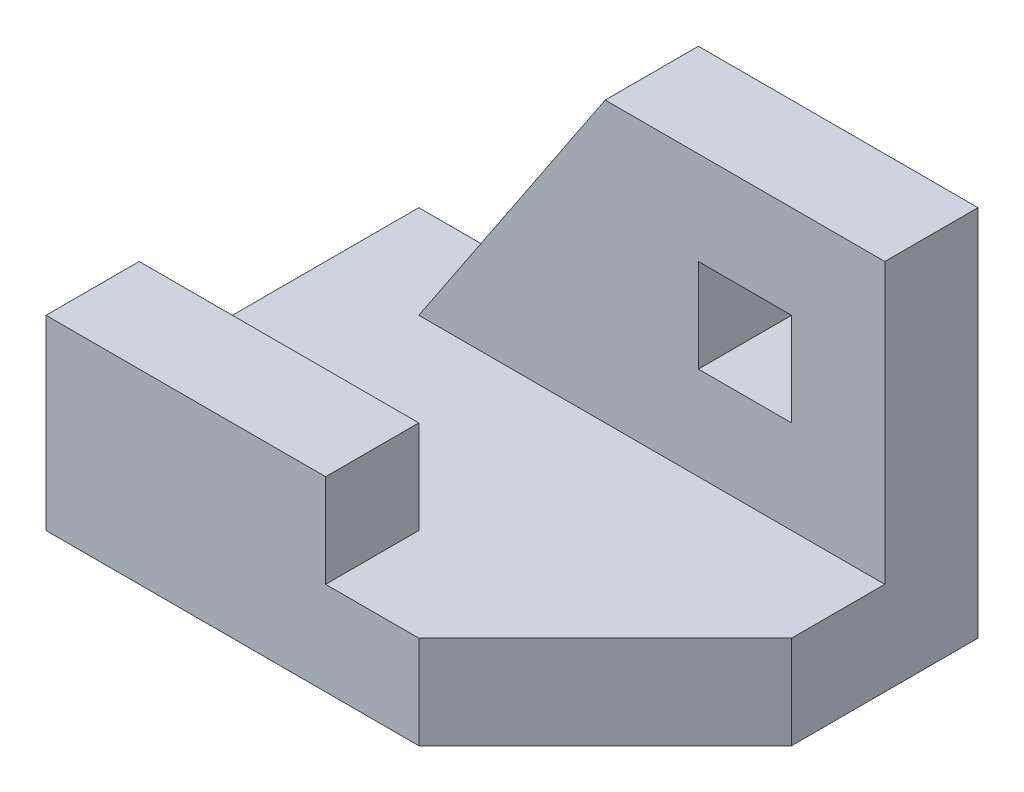
ISO-10303-21;
HEADER;
FILE_DESCRIPTION(('STEP AP214'),'2;1');
FILE_NAME('part.step','',(''),(''),'','','');
FILE_SCHEMA(('AUTOMOTIVE_DESIGN { 1 0 10303 214 1 1 1 1 }'));
ENDSEC;
DATA;
#1=APPLICATION_CONTEXT('core data for automotive mechanical design processes');
#2=APPLICATION_PROTOCOL_DEFINITION('international standard','automotive_design',2000,#1);
#3=PRODUCT_CONTEXT('',#1,'mechanical');
#4=PRODUCT('Part','Part','',(#3));
#5=PRODUCT_RELATED_PRODUCT_CATEGORY('part','',(#4));
#6=PRODUCT_DEFINITION_FORMATION('','',#4);
#7=PRODUCT_DEFINITION_CONTEXT('part definition',#1,'design');
#8=PRODUCT_DEFINITION('design','',#6,#7);
#9=PRODUCT_DEFINITION_SHAPE('','',#8);
#10=(LENGTH_UNIT() NAMED_UNIT(*) SI_UNIT(.MILLI.,.METRE.));
#11=(NAMED_UNIT(*) PLANE_ANGLE_UNIT() SI_UNIT($,.RADIAN.));
#12=(NAMED_UNIT(*) SI_UNIT($,.STERADIAN.) SOLID_ANGLE_UNIT());
#13=UNCERTAINTY_MEASURE_WITH_UNIT(LENGTH_MEASURE(1.E-05),#10,'distance_accuracy_value','');
#14=(GEOMETRIC_REPRESENTATION_CONTEXT(3) GLOBAL_UNCERTAINTY_ASSIGNED_CONTEXT((#13)) GLOBAL_UNIT_ASSIGNED_CONTEXT((#10,
#11,#12)) REPRESENTATION_CONTEXT('',''));
#15=CARTESIAN_POINT('',(0.,0.,0.));
#16=DIRECTION('',(0.,0.,1.));
#17=DIRECTION('',(1.,0.,0.));
#18=AXIS2_PLACEMENT_3D('',#15,#16,#17);
#19=CARTESIAN_POINT('',(0.,1.,0.));
#20=DIRECTION('',(0.,-1.,0.));
#21=DIRECTION('',(0.,0.,-1.));
#22=AXIS2_PLACEMENT_3D('',#19,#20,#21);
#23=PLANE('',#22);
#24=DIRECTION('',(-1.,0.,0.));
#25=VECTOR('',#24,1.);
#26=CARTESIAN_POINT('',(1.,1.,-3.));
#27=LINE('',#26,#25);
#28=CARTESIAN_POINT('',(6.,1.,-3.));
#29=VERTEX_POINT('',#28);
#30=CARTESIAN_POINT('',(1.,1.,-3.));
#31=VERTEX_POINT('',#30);
#32=EDGE_CURVE('E179',#29,#31,#27,.T.);
#33=ORIENTED_EDGE('',*,*,#32,.T.);
#34=DIRECTION('',(0.,0.,-1.));
#35=VECTOR('',#34,1.);
#36=CARTESIAN_POINT('',(1.,1.,-3.));
#37=LINE('',#36,#35);
#38=CARTESIAN_POINT('',(1.,1.,-4.));
#39=VERTEX_POINT('',#38);
#40=EDGE_CURVE('E191',#31,#39,#37,.T.);
#41=ORIENTED_EDGE('',*,*,#40,.T.);
#42=DIRECTION('',(-1.,0.,0.));
#43=VECTOR('',#42,1.);
#44=CARTESIAN_POINT('',(0.,1.,-4.));
#45=LINE('',#44,#43);
#46=CARTESIAN_POINT('',(0.,1.,-4.));
#47=VERTEX_POINT('',#46);
#48=EDGE_CURVE('E233',#39,#47,#45,.T.);
#49=ORIENTED_EDGE('',*,*,#48,.T.);
#50=DIRECTION('',(0.,0.,1.));
#51=VECTOR('',#50,1.);
#52=CARTESIAN_POINT('',(0.,1.,0.));
#53=LINE('',#52,#51);
#54=CARTESIAN_POINT('',(0.,1.,-1.));
#55=VERTEX_POINT('',#54);
#56=EDGE_CURVE('E235',#47,#55,#53,.T.);
#57=ORIENTED_EDGE('',*,*,#56,.T.);
#58=DIRECTION('',(-1.,0.,0.));
#59=VECTOR('',#58,1.);
#60=CARTESIAN_POINT('',(3.,1.,-1.));
#61=LINE('',#60,#59);
#62=CARTESIAN_POINT('',(3.,1.,-1.));
#63=VERTEX_POINT('',#62);
#64=EDGE_CURVE('E212',#63,#55,#61,.T.);
#65=ORIENTED_EDGE('',*,*,#64,.F.);
#66=DIRECTION('',(0.,0.,1.));
#67=VECTOR('',#66,1.);
#68=CARTESIAN_POINT('',(3.,1.,-1.));
#69=LINE('',#68,#67);
#70=CARTESIAN_POINT('',(3.,1.,0.));
#71=VERTEX_POINT('',#70);
#72=EDGE_CURVE('E214',#63,#71,#69,.T.);
#73=ORIENTED_EDGE('',*,*,#72,.T.);
#74=DIRECTION('',(1.,0.,0.));
#75=VECTOR('',#74,1.);
#76=CARTESIAN_POINT('',(4.,1.,0.));
#77=LINE('',#76,#75);
#78=CARTESIAN_POINT('',(4.,1.,0.));
#79=VERTEX_POINT('',#78);
#80=EDGE_CURVE('E226',#71,#79,#77,.T.);
#81=ORIENTED_EDGE('',*,*,#80,.T.);
#82=DIRECTION('',(0.707106781186548,0.,-0.707106781186547));
#83=VECTOR('',#82,1.);
#84=CARTESIAN_POINT('',(6.,1.,-2.));
#85=LINE('',#84,#83);
#86=CARTESIAN_POINT('',(6.,1.,-2.));
#87=VERTEX_POINT('',#86);
#88=EDGE_CURVE('E228',#79,#87,#85,.T.);
#89=ORIENTED_EDGE('',*,*,#88,.T.);
#90=DIRECTION('',(0.,0.,-1.));
#91=VECTOR('',#90,1.);
#92=CARTESIAN_POINT('',(6.,1.,-4.));
#93=LINE('',#92,#91);
#94=EDGE_CURVE('E231',#87,#29,#93,.T.);
#95=ORIENTED_EDGE('',*,*,#94,.T.);
#96=EDGE_LOOP('',(#33,#41,#49,#57,#65,#73,#81,#89,#95));
#97=FACE_BOUND('',#96,.T.);
#98=ADVANCED_FACE('F35',(#97),#23,.F.);
#99=CARTESIAN_POINT('',(4.,1.,0.));
#100=DIRECTION('',(0.,0.,-1.));
#101=DIRECTION('',(-1.,0.,0.));
#102=AXIS2_PLACEMENT_3D('',#99,#100,#101);
#103=PLANE('',#102);
#104=DIRECTION('',(1.,0.,0.));
#105=VECTOR('',#104,1.);
#106=CARTESIAN_POINT('',(4.,0.,0.));
#107=LINE('',#106,#105);
#108=CARTESIAN_POINT('',(0.,0.,0.));
#109=VERTEX_POINT('',#108);
#110=CARTESIAN_POINT('',(4.,0.,0.));
#111=VERTEX_POINT('',#110);
#112=EDGE_CURVE('E225',#109,#111,#107,.T.);
#113=ORIENTED_EDGE('',*,*,#112,.T.);
#114=DIRECTION('',(0.,-1.,0.));
#115=VECTOR('',#114,1.);
#116=CARTESIAN_POINT('',(4.,1.,0.));
#117=LINE('',#116,#115);
#118=EDGE_CURVE('E11',#79,#111,#117,.T.);
#119=ORIENTED_EDGE('',*,*,#118,.F.);
#120=ORIENTED_EDGE('',*,*,#80,.F.);
#121=DIRECTION('',(0.,-1.,0.));
#122=VECTOR('',#121,1.);
#123=CARTESIAN_POINT('',(3.,2.,0.));
#124=LINE('',#123,#122);
#125=CARTESIAN_POINT('',(3.,2.,0.));
#126=VERTEX_POINT('',#125);
#127=EDGE_CURVE('E208',#126,#71,#124,.T.);
#128=ORIENTED_EDGE('',*,*,#127,.F.);
#129=DIRECTION('',(1.,0.,0.));
#130=VECTOR('',#129,1.);
#131=CARTESIAN_POINT('',(0.,2.,0.));
#132=LINE('',#131,#130);
#133=CARTESIAN_POINT('',(0.,2.,0.));
#134=VERTEX_POINT('',#133);
#135=EDGE_CURVE('E199',#134,#126,#132,.T.);
#136=ORIENTED_EDGE('',*,*,#135,.F.);
#137=DIRECTION('',(0.,-1.,0.));
#138=VECTOR('',#137,1.);
#139=CARTESIAN_POINT('',(0.,1.,0.));
#140=LINE('',#139,#138);
#141=EDGE_CURVE('E238',#134,#109,#140,.T.);
#142=ORIENTED_EDGE('',*,*,#141,.T.);
#143=EDGE_LOOP('',(#113,#119,#120,#128,#136,#142));
#144=FACE_BOUND('',#143,.T.);
#145=ADVANCED_FACE('F37',(#144),#103,.F.);
#146=CARTESIAN_POINT('',(6.,1.,-2.));
#147=DIRECTION('',(-0.707106781186547,0.,-0.707106781186548));
#148=DIRECTION('',(-0.707106781186548,0.,0.707106781186547));
#149=AXIS2_PLACEMENT_3D('',#146,#147,#148);
#150=PLANE('',#149);
#151=DIRECTION('',(0.707106781186548,0.,-0.707106781186547));
#152=VECTOR('',#151,1.);
#153=CARTESIAN_POINT('',(6.,0.,-2.));
#154=LINE('',#153,#152);
#155=CARTESIAN_POINT('',(6.,0.,-2.));
#156=VERTEX_POINT('',#155);
#157=EDGE_CURVE('E241',#111,#156,#154,.T.);
#158=ORIENTED_EDGE('',*,*,#157,.T.);
#159=DIRECTION('',(0.,-1.,0.));
#160=VECTOR('',#159,1.);
#161=CARTESIAN_POINT('',(6.,1.,-2.));
#162=LINE('',#161,#160);
#163=EDGE_CURVE('E43',#87,#156,#162,.T.);
#164=ORIENTED_EDGE('',*,*,#163,.F.);
#165=ORIENTED_EDGE('',*,*,#88,.F.);
#166=ORIENTED_EDGE('',*,*,#118,.T.);
#167=EDGE_LOOP('',(#158,#164,#165,#166));
#168=FACE_BOUND('',#167,.T.);
#169=ADVANCED_FACE('F291',(#168),#150,.F.);
#170=CARTESIAN_POINT('',(6.,1.,-4.));
#171=DIRECTION('',(-1.,0.,0.));
#172=DIRECTION('',(0.,0.,1.));
#173=AXIS2_PLACEMENT_3D('',#170,#171,#172);
#174=PLANE('',#173);
#175=DIRECTION('',(0.,0.,-1.));
#176=VECTOR('',#175,1.);
#177=CARTESIAN_POINT('',(6.,0.,-4.));
#178=LINE('',#177,#176);
#179=CARTESIAN_POINT('',(6.,0.,-4.));
#180=VERTEX_POINT('',#179);
#181=EDGE_CURVE('E243',#156,#180,#178,.T.);
#182=ORIENTED_EDGE('',*,*,#181,.T.);
#183=DIRECTION('',(0.,-1.,0.));
#184=VECTOR('',#183,1.);
#185=CARTESIAN_POINT('',(6.,1.,-4.));
#186=LINE('',#185,#184);
#187=CARTESIAN_POINT('',(6.,4.,-4.));
#188=VERTEX_POINT('',#187);
#189=EDGE_CURVE('E253',#188,#180,#186,.T.);
#190=ORIENTED_EDGE('',*,*,#189,.F.);
#191=DIRECTION('',(0.,0.,-1.));
#192=VECTOR('',#191,1.);
#193=CARTESIAN_POINT('',(6.,4.,-3.));
#194=LINE('',#193,#192);
#195=CARTESIAN_POINT('',(6.,4.,-3.));
#196=VERTEX_POINT('',#195);
#197=EDGE_CURVE('E196',#196,#188,#194,.T.);
#198=ORIENTED_EDGE('',*,*,#197,.F.);
#199=DIRECTION('',(0.,-1.,0.));
#200=VECTOR('',#199,1.);
#201=CARTESIAN_POINT('',(6.,1.,-3.));
#202=LINE('',#201,#200);
#203=EDGE_CURVE('E188',#196,#29,#202,.T.);
#204=ORIENTED_EDGE('',*,*,#203,.T.);
#205=ORIENTED_EDGE('',*,*,#94,.F.);
#206=ORIENTED_EDGE('',*,*,#163,.T.);
#207=EDGE_LOOP('',(#182,#190,#198,#204,#205,#206));
#208=FACE_BOUND('',#207,.T.);
#209=ADVANCED_FACE('F260',(#208),#174,.F.);
#210=CARTESIAN_POINT('',(0.,1.,-4.));
#211=DIRECTION('',(0.,0.,1.));
#212=DIRECTION('',(1.,0.,0.));
#213=AXIS2_PLACEMENT_3D('',#210,#211,#212);
#214=PLANE('',#213);
#215=DIRECTION('',(1.,0.,0.));
#216=VECTOR('',#215,1.);
#217=CARTESIAN_POINT('',(5.,3.,-4.));
#218=LINE('',#217,#216);
#219=CARTESIAN_POINT('',(4.,3.,-4.));
#220=VERTEX_POINT('',#219);
#221=CARTESIAN_POINT('',(5.,3.,-4.));
#222=VERTEX_POINT('',#221);
#223=EDGE_CURVE('E169',#220,#222,#218,.T.);
#224=ORIENTED_EDGE('',*,*,#223,.F.);
#225=DIRECTION('',(0.,1.,0.));
#226=VECTOR('',#225,1.);
#227=CARTESIAN_POINT('',(4.,3.,-4.));
#228=LINE('',#227,#226);
#229=CARTESIAN_POINT('',(4.,2.,-4.));
#230=VERTEX_POINT('',#229);
#231=EDGE_CURVE('E50',#230,#220,#228,.T.);
#232=ORIENTED_EDGE('',*,*,#231,.F.);
#233=DIRECTION('',(-1.,0.,0.));
#234=VECTOR('',#233,1.);
#235=CARTESIAN_POINT('',(4.,2.,-4.));
#236=LINE('',#235,#234);
#237=CARTESIAN_POINT('',(5.,2.,-4.));
#238=VERTEX_POINT('',#237);
#239=EDGE_CURVE('E160',#238,#230,#236,.T.);
#240=ORIENTED_EDGE('',*,*,#239,.F.);
#241=DIRECTION('',(0.,-1.,0.));
#242=VECTOR('',#241,1.);
#243=CARTESIAN_POINT('',(5.,2.,-4.));
#244=LINE('',#243,#242);
#245=EDGE_CURVE('E163',#222,#238,#244,.T.);
#246=ORIENTED_EDGE('',*,*,#245,.F.);
#247=EDGE_LOOP('',(#224,#232,#240,#246));
#248=FACE_BOUND('',#247,.T.);
#249=DIRECTION('',(-1.,0.,0.));
#250=VECTOR('',#249,1.);
#251=CARTESIAN_POINT('',(0.,0.,-4.));
#252=LINE('',#251,#250);
#253=CARTESIAN_POINT('',(0.,0.,-4.));
#254=VERTEX_POINT('',#253);
#255=EDGE_CURVE('E245',#180,#254,#252,.T.);
#256=ORIENTED_EDGE('',*,*,#255,.T.);
#257=DIRECTION('',(0.,-1.,0.));
#258=VECTOR('',#257,1.);
#259=CARTESIAN_POINT('',(0.,1.,-4.));
#260=LINE('',#259,#258);
#261=EDGE_CURVE('E250',#47,#254,#260,.T.);
#262=ORIENTED_EDGE('',*,*,#261,.F.);
#263=ORIENTED_EDGE('',*,*,#48,.F.);
#264=DIRECTION('',(0.554700196225229,0.832050294337844,0.));
#265=VECTOR('',#264,1.);
#266=CARTESIAN_POINT('',(3.,4.,-4.));
#267=LINE('',#266,#265);
#268=CARTESIAN_POINT('',(3.,4.,-4.));
#269=VERTEX_POINT('',#268);
#270=EDGE_CURVE('E175',#39,#269,#267,.T.);
#271=ORIENTED_EDGE('',*,*,#270,.T.);
#272=DIRECTION('',(1.,0.,0.));
#273=VECTOR('',#272,1.);
#274=CARTESIAN_POINT('',(6.,4.,-4.));
#275=LINE('',#274,#273);
#276=EDGE_CURVE('E182',#269,#188,#275,.T.);
#277=ORIENTED_EDGE('',*,*,#276,.T.);
#278=ORIENTED_EDGE('',*,*,#189,.T.);
#279=EDGE_LOOP('',(#256,#262,#263,#271,#277,#278));
#280=FACE_BOUND('',#279,.T.);
#281=ADVANCED_FACE('F270',(#248,#280),#214,.F.);
#282=CARTESIAN_POINT('',(0.,1.,0.));
#283=DIRECTION('',(1.,0.,0.));
#284=DIRECTION('',(0.,0.,-1.));
#285=AXIS2_PLACEMENT_3D('',#282,#283,#284);
#286=PLANE('',#285);
#287=DIRECTION('',(0.,0.,1.));
#288=VECTOR('',#287,1.);
#289=CARTESIAN_POINT('',(0.,0.,0.));
#290=LINE('',#289,#288);
#291=EDGE_CURVE('E229',#254,#109,#290,.T.);
#292=ORIENTED_EDGE('',*,*,#291,.T.);
#293=ORIENTED_EDGE('',*,*,#141,.F.);
#294=DIRECTION('',(0.,0.,1.));
#295=VECTOR('',#294,1.);
#296=CARTESIAN_POINT('',(0.,2.,-1.));
#297=LINE('',#296,#295);
#298=CARTESIAN_POINT('',(0.,2.,-1.));
#299=VERTEX_POINT('',#298);
#300=EDGE_CURVE('E222',#299,#134,#297,.T.);
#301=ORIENTED_EDGE('',*,*,#300,.F.);
#302=DIRECTION('',(0.,1.,0.));
#303=VECTOR('',#302,1.);
#304=CARTESIAN_POINT('',(0.,1.,-1.));
#305=LINE('',#304,#303);
#306=EDGE_CURVE('E204',#55,#299,#305,.T.);
#307=ORIENTED_EDGE('',*,*,#306,.F.);
#308=ORIENTED_EDGE('',*,*,#56,.F.);
#309=ORIENTED_EDGE('',*,*,#261,.T.);
#310=EDGE_LOOP('',(#292,#293,#301,#307,#308,#309));
#311=FACE_BOUND('',#310,.T.);
#312=ADVANCED_FACE('F273',(#311),#286,.F.);
#313=CARTESIAN_POINT('',(0.,0.,0.));
#314=DIRECTION('',(0.,-1.,0.));
#315=DIRECTION('',(0.,0.,-1.));
#316=AXIS2_PLACEMENT_3D('',#313,#314,#315);
#317=PLANE('',#316);
#318=ORIENTED_EDGE('',*,*,#112,.F.);
#319=ORIENTED_EDGE('',*,*,#291,.F.);
#320=ORIENTED_EDGE('',*,*,#255,.F.);
#321=ORIENTED_EDGE('',*,*,#181,.F.);
#322=ORIENTED_EDGE('',*,*,#157,.F.);
#323=EDGE_LOOP('',(#318,#319,#320,#321,#322));
#324=FACE_BOUND('',#323,.T.);
#325=ADVANCED_FACE('F266',(#324),#317,.T.);
#326=CARTESIAN_POINT('',(0.,2.,-1.));
#327=DIRECTION('',(0.,-1.,0.));
#328=DIRECTION('',(0.,0.,-1.));
#329=AXIS2_PLACEMENT_3D('',#326,#327,#328);
#330=PLANE('',#329);
#331=ORIENTED_EDGE('',*,*,#135,.T.);
#332=DIRECTION('',(0.,0.,1.));
#333=VECTOR('',#332,1.);
#334=CARTESIAN_POINT('',(3.,2.,-1.));
#335=LINE('',#334,#333);
#336=CARTESIAN_POINT('',(3.,2.,-1.));
#337=VERTEX_POINT('',#336);
#338=EDGE_CURVE('E219',#337,#126,#335,.T.);
#339=ORIENTED_EDGE('',*,*,#338,.F.);
#340=DIRECTION('',(1.,0.,0.));
#341=VECTOR('',#340,1.);
#342=CARTESIAN_POINT('',(0.,2.,-1.));
#343=LINE('',#342,#341);
#344=EDGE_CURVE('E207',#299,#337,#343,.T.);
#345=ORIENTED_EDGE('',*,*,#344,.F.);
#346=ORIENTED_EDGE('',*,*,#300,.T.);
#347=EDGE_LOOP('',(#331,#339,#345,#346));
#348=FACE_BOUND('',#347,.T.);
#349=ADVANCED_FACE('F296',(#348),#330,.F.);
#350=CARTESIAN_POINT('',(3.,2.,-1.));
#351=DIRECTION('',(-1.,0.,0.));
#352=DIRECTION('',(0.,0.,1.));
#353=AXIS2_PLACEMENT_3D('',#350,#351,#352);
#354=PLANE('',#353);
#355=ORIENTED_EDGE('',*,*,#127,.T.);
#356=ORIENTED_EDGE('',*,*,#72,.F.);
#357=DIRECTION('',(0.,-1.,0.));
#358=VECTOR('',#357,1.);
#359=CARTESIAN_POINT('',(3.,2.,-1.));
#360=LINE('',#359,#358);
#361=EDGE_CURVE('E210',#337,#63,#360,.T.);
#362=ORIENTED_EDGE('',*,*,#361,.F.);
#363=ORIENTED_EDGE('',*,*,#338,.T.);
#364=EDGE_LOOP('',(#355,#356,#362,#363));
#365=FACE_BOUND('',#364,.T.);
#366=ADVANCED_FACE('F303',(#365),#354,.F.);
#367=CARTESIAN_POINT('',(0.,0.,-1.));
#368=DIRECTION('',(0.,0.,-1.));
#369=DIRECTION('',(-1.,0.,0.));
#370=AXIS2_PLACEMENT_3D('',#367,#368,#369);
#371=PLANE('',#370);
#372=ORIENTED_EDGE('',*,*,#306,.T.);
#373=ORIENTED_EDGE('',*,*,#344,.T.);
#374=ORIENTED_EDGE('',*,*,#361,.T.);
#375=ORIENTED_EDGE('',*,*,#64,.T.);
#376=EDGE_LOOP('',(#372,#373,#374,#375));
#377=FACE_BOUND('',#376,.T.);
#378=ADVANCED_FACE('F300',(#377),#371,.T.);
#379=CARTESIAN_POINT('',(6.,4.,-3.));
#380=DIRECTION('',(0.,1.,0.));
#381=DIRECTION('',(0.,0.,1.));
#382=AXIS2_PLACEMENT_3D('',#379,#380,#381);
#383=PLANE('',#382);
#384=ORIENTED_EDGE('',*,*,#276,.F.);
#385=DIRECTION('',(0.,0.,-1.));
#386=VECTOR('',#385,1.);
#387=CARTESIAN_POINT('',(3.,4.,-3.));
#388=LINE('',#387,#386);
#389=CARTESIAN_POINT('',(3.,4.,-3.));
#390=VERTEX_POINT('',#389);
#391=EDGE_CURVE('E200',#390,#269,#388,.T.);
#392=ORIENTED_EDGE('',*,*,#391,.F.);
#393=DIRECTION('',(1.,0.,0.));
#394=VECTOR('',#393,1.);
#395=CARTESIAN_POINT('',(6.,4.,-3.));
#396=LINE('',#395,#394);
#397=EDGE_CURVE('E185',#390,#196,#396,.T.);
#398=ORIENTED_EDGE('',*,*,#397,.T.);
#399=ORIENTED_EDGE('',*,*,#197,.T.);
#400=EDGE_LOOP('',(#384,#392,#398,#399));
#401=FACE_BOUND('',#400,.T.);
#402=ADVANCED_FACE('F286',(#401),#383,.T.);
#403=CARTESIAN_POINT('',(3.,4.,-3.));
#404=DIRECTION('',(-0.832050294337844,0.554700196225229,0.));
#405=DIRECTION('',(-0.554700196225229,-0.832050294337844,0.));
#406=AXIS2_PLACEMENT_3D('',#403,#404,#405);
#407=PLANE('',#406);
#408=ORIENTED_EDGE('',*,*,#270,.F.);
#409=ORIENTED_EDGE('',*,*,#40,.F.);
#410=DIRECTION('',(0.554700196225229,0.832050294337844,0.));
#411=VECTOR('',#410,1.);
#412=CARTESIAN_POINT('',(3.,4.,-3.));
#413=LINE('',#412,#411);
#414=EDGE_CURVE('E181',#31,#390,#413,.T.);
#415=ORIENTED_EDGE('',*,*,#414,.T.);
#416=ORIENTED_EDGE('',*,*,#391,.T.);
#417=EDGE_LOOP('',(#408,#409,#415,#416));
#418=FACE_BOUND('',#417,.T.);
#419=ADVANCED_FACE('F282',(#418),#407,.T.);
#420=CARTESIAN_POINT('',(0.,0.,-3.));
#421=DIRECTION('',(0.,0.,1.));
#422=DIRECTION('',(1.,0.,0.));
#423=AXIS2_PLACEMENT_3D('',#420,#421,#422);
#424=PLANE('',#423);
#425=DIRECTION('',(0.,1.,0.));
#426=VECTOR('',#425,1.);
#427=CARTESIAN_POINT('',(4.,3.,-3.));
#428=LINE('',#427,#426);
#429=CARTESIAN_POINT('',(4.,2.,-3.));
#430=VERTEX_POINT('',#429);
#431=CARTESIAN_POINT('',(4.,3.,-3.));
#432=VERTEX_POINT('',#431);
#433=EDGE_CURVE('E144',#430,#432,#428,.T.);
#434=ORIENTED_EDGE('',*,*,#433,.T.);
#435=DIRECTION('',(1.,0.,0.));
#436=VECTOR('',#435,1.);
#437=CARTESIAN_POINT('',(5.,3.,-3.));
#438=LINE('',#437,#436);
#439=CARTESIAN_POINT('',(5.,3.,-3.));
#440=VERTEX_POINT('',#439);
#441=EDGE_CURVE('E153',#432,#440,#438,.T.);
#442=ORIENTED_EDGE('',*,*,#441,.T.);
#443=DIRECTION('',(0.,-1.,0.));
#444=VECTOR('',#443,1.);
#445=CARTESIAN_POINT('',(5.,2.,-3.));
#446=LINE('',#445,#444);
#447=CARTESIAN_POINT('',(5.,2.,-3.));
#448=VERTEX_POINT('',#447);
#449=EDGE_CURVE('E58',#440,#448,#446,.T.);
#450=ORIENTED_EDGE('',*,*,#449,.T.);
#451=DIRECTION('',(-1.,0.,0.));
#452=VECTOR('',#451,1.);
#453=CARTESIAN_POINT('',(4.,2.,-3.));
#454=LINE('',#453,#452);
#455=EDGE_CURVE('E150',#448,#430,#454,.T.);
#456=ORIENTED_EDGE('',*,*,#455,.T.);
#457=EDGE_LOOP('',(#434,#442,#450,#456));
#458=FACE_BOUND('',#457,.T.);
#459=ORIENTED_EDGE('',*,*,#32,.F.);
#460=ORIENTED_EDGE('',*,*,#203,.F.);
#461=ORIENTED_EDGE('',*,*,#397,.F.);
#462=ORIENTED_EDGE('',*,*,#414,.F.);
#463=EDGE_LOOP('',(#459,#460,#461,#462));
#464=FACE_BOUND('',#463,.T.);
#465=ADVANCED_FACE('F157',(#458,#464),#424,.T.);
#466=CARTESIAN_POINT('',(4.,3.,-3.));
#467=DIRECTION('',(-1.,0.,0.));
#468=DIRECTION('',(0.,0.,1.));
#469=AXIS2_PLACEMENT_3D('',#466,#467,#468);
#470=PLANE('',#469);
#471=ORIENTED_EDGE('',*,*,#231,.T.);
#472=DIRECTION('',(0.,0.,-1.));
#473=VECTOR('',#472,1.);
#474=CARTESIAN_POINT('',(4.,3.,-3.));
#475=LINE('',#474,#473);
#476=EDGE_CURVE('E140',#432,#220,#475,.T.);
#477=ORIENTED_EDGE('',*,*,#476,.F.);
#478=ORIENTED_EDGE('',*,*,#433,.F.);
#479=DIRECTION('',(0.,0.,-1.));
#480=VECTOR('',#479,1.);
#481=CARTESIAN_POINT('',(4.,2.,-3.));
#482=LINE('',#481,#480);
#483=EDGE_CURVE('E173',#430,#230,#482,.T.);
#484=ORIENTED_EDGE('',*,*,#483,.T.);
#485=EDGE_LOOP('',(#471,#477,#478,#484));
#486=FACE_BOUND('',#485,.T.);
#487=ADVANCED_FACE('F142',(#486),#470,.F.);
#488=CARTESIAN_POINT('',(4.,2.,-3.));
#489=DIRECTION('',(0.,-1.,0.));
#490=DIRECTION('',(0.,0.,-1.));
#491=AXIS2_PLACEMENT_3D('',#488,#489,#490);
#492=PLANE('',#491);
#493=ORIENTED_EDGE('',*,*,#239,.T.);
#494=ORIENTED_EDGE('',*,*,#483,.F.);
#495=ORIENTED_EDGE('',*,*,#455,.F.);
#496=DIRECTION('',(0.,0.,-1.));
#497=VECTOR('',#496,1.);
#498=CARTESIAN_POINT('',(5.,2.,-3.));
#499=LINE('',#498,#497);
#500=EDGE_CURVE('E176',#448,#238,#499,.T.);
#501=ORIENTED_EDGE('',*,*,#500,.T.);
#502=EDGE_LOOP('',(#493,#494,#495,#501));
#503=FACE_BOUND('',#502,.T.);
#504=ADVANCED_FACE('F422',(#503),#492,.F.);
#505=CARTESIAN_POINT('',(5.,2.,-3.));
#506=DIRECTION('',(1.,0.,0.));
#507=DIRECTION('',(0.,0.,-1.));
#508=AXIS2_PLACEMENT_3D('',#505,#506,#507);
#509=PLANE('',#508);
#510=ORIENTED_EDGE('',*,*,#245,.T.);
#511=ORIENTED_EDGE('',*,*,#500,.F.);
#512=ORIENTED_EDGE('',*,*,#449,.F.);
#513=DIRECTION('',(0.,0.,-1.));
#514=VECTOR('',#513,1.);
#515=CARTESIAN_POINT('',(5.,3.,-3.));
#516=LINE('',#515,#514);
#517=EDGE_CURVE('E149',#440,#222,#516,.T.);
#518=ORIENTED_EDGE('',*,*,#517,.T.);
#519=EDGE_LOOP('',(#510,#511,#512,#518));
#520=FACE_BOUND('',#519,.T.);
#521=ADVANCED_FACE('F430',(#520),#509,.F.);
#522=CARTESIAN_POINT('',(5.,3.,-3.));
#523=DIRECTION('',(0.,1.,0.));
#524=DIRECTION('',(0.,0.,1.));
#525=AXIS2_PLACEMENT_3D('',#522,#523,#524);
#526=PLANE('',#525);
#527=ORIENTED_EDGE('',*,*,#223,.T.);
#528=ORIENTED_EDGE('',*,*,#517,.F.);
#529=ORIENTED_EDGE('',*,*,#441,.F.);
#530=ORIENTED_EDGE('',*,*,#476,.T.);
#531=EDGE_LOOP('',(#527,#528,#529,#530));
#532=FACE_BOUND('',#531,.T.);
#533=ADVANCED_FACE('F154',(#532),#526,.F.);
#534=CLOSED_SHELL('',(#98,#145,#169,#209,#281,#312,#325,#349,#366,#378,#402,#419,#465,#487,#504,
#521,#533));
#535=MANIFOLD_SOLID_BREP('B2',#534);
#536=ADVANCED_BREP_SHAPE_REPRESENTATION('',(#18,#535),#14);
#537=SHAPE_DEFINITION_REPRESENTATION(#9,#536);
ENDSEC;
END-ISO-10303-21;
